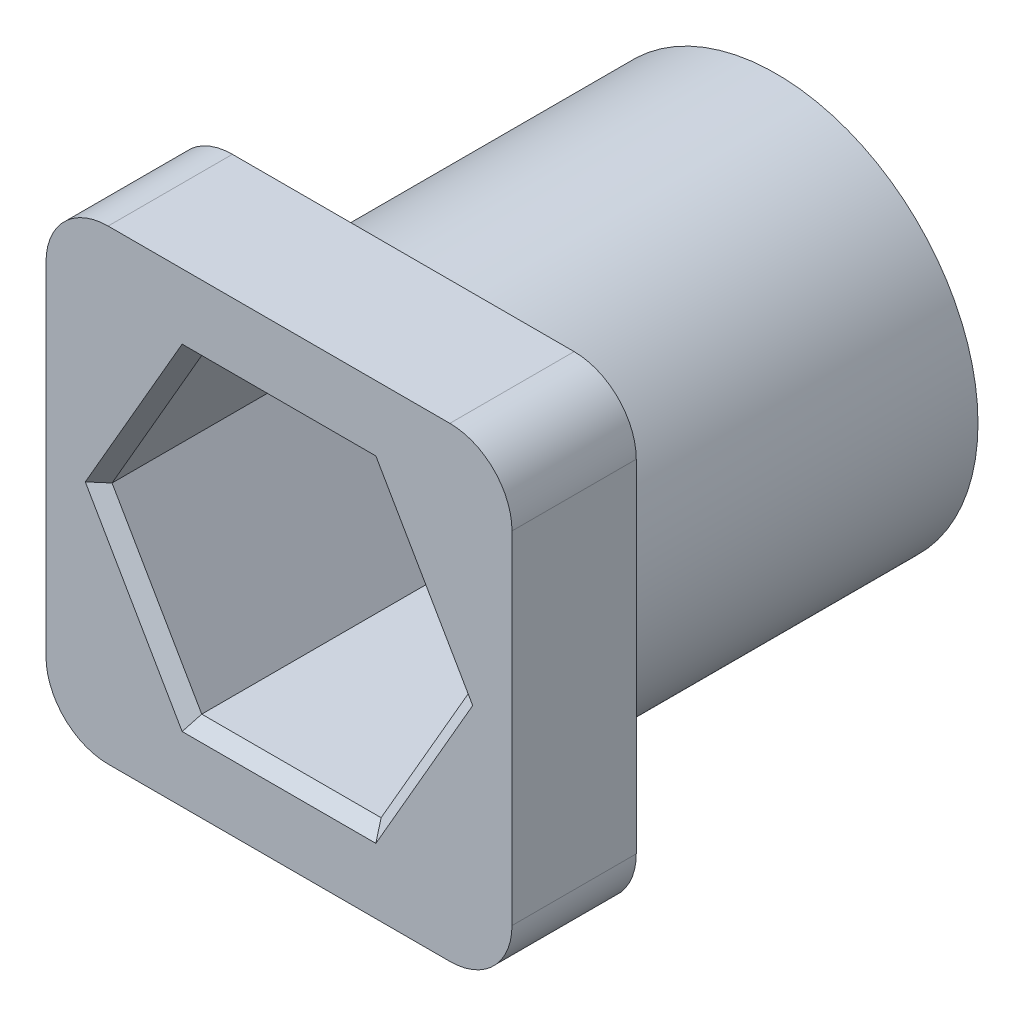
ISO-10303-21;
HEADER;
FILE_DESCRIPTION(('STEP AP214'),'2;1');
FILE_NAME('part.step','',(''),(''),'','','');
FILE_SCHEMA(('AUTOMOTIVE_DESIGN { 1 0 10303 214 1 1 1 1 }'));
ENDSEC;
DATA;
#1=APPLICATION_CONTEXT('core data for automotive mechanical design processes');
#2=APPLICATION_PROTOCOL_DEFINITION('international standard','automotive_design',2000,#1);
#3=PRODUCT_CONTEXT('',#1,'mechanical');
#4=PRODUCT('Part','Part','',(#3));
#5=PRODUCT_RELATED_PRODUCT_CATEGORY('part','',(#4));
#6=PRODUCT_DEFINITION_FORMATION('','',#4);
#7=PRODUCT_DEFINITION_CONTEXT('part definition',#1,'design');
#8=PRODUCT_DEFINITION('design','',#6,#7);
#9=PRODUCT_DEFINITION_SHAPE('','',#8);
#10=(LENGTH_UNIT() NAMED_UNIT(*) SI_UNIT(.MILLI.,.METRE.));
#11=(NAMED_UNIT(*) PLANE_ANGLE_UNIT() SI_UNIT($,.RADIAN.));
#12=(NAMED_UNIT(*) SI_UNIT($,.STERADIAN.) SOLID_ANGLE_UNIT());
#13=UNCERTAINTY_MEASURE_WITH_UNIT(LENGTH_MEASURE(1.E-05),#10,'distance_accuracy_value','');
#14=(GEOMETRIC_REPRESENTATION_CONTEXT(3) GLOBAL_UNCERTAINTY_ASSIGNED_CONTEXT((#13)) GLOBAL_UNIT_ASSIGNED_CONTEXT((#10,
#11,#12)) REPRESENTATION_CONTEXT('',''));
#15=CARTESIAN_POINT('',(0.,0.,0.));
#16=DIRECTION('',(0.,0.,1.));
#17=DIRECTION('',(1.,0.,0.));
#18=AXIS2_PLACEMENT_3D('',#15,#16,#17);
#19=CARTESIAN_POINT('',(9.525,-9.525,-5.08));
#20=DIRECTION('',(1.,0.,0.));
#21=DIRECTION('',(0.,0.,-1.));
#22=AXIS2_PLACEMENT_3D('',#19,#20,#21);
#23=PLANE('',#22);
#24=DIRECTION('',(0.,1.,0.));
#25=VECTOR('',#24,1.);
#26=CARTESIAN_POINT('',(9.525,-9.525,0.));
#27=LINE('',#26,#25);
#28=CARTESIAN_POINT('',(9.525,-6.985,0.));
#29=VERTEX_POINT('',#28);
#30=CARTESIAN_POINT('',(9.525,6.98499999999999,0.));
#31=VERTEX_POINT('',#30);
#32=EDGE_CURVE('E202',#29,#31,#27,.T.);
#33=ORIENTED_EDGE('',*,*,#32,.F.);
#34=DIRECTION('',(0.,0.,1.));
#35=VECTOR('',#34,1.);
#36=CARTESIAN_POINT('',(9.525,-6.985,-5.08));
#37=LINE('',#36,#35);
#38=CARTESIAN_POINT('',(9.525,-6.985,-5.08));
#39=VERTEX_POINT('',#38);
#40=EDGE_CURVE('E244',#29,#39,#37,.F.);
#41=ORIENTED_EDGE('',*,*,#40,.T.);
#42=DIRECTION('',(0.,1.,0.));
#43=VECTOR('',#42,1.);
#44=CARTESIAN_POINT('',(9.525,-9.525,-5.08));
#45=LINE('',#44,#43);
#46=CARTESIAN_POINT('',(9.525,6.98499999999999,-5.08));
#47=VERTEX_POINT('',#46);
#48=EDGE_CURVE('E205',#39,#47,#45,.T.);
#49=ORIENTED_EDGE('',*,*,#48,.T.);
#50=DIRECTION('',(0.,0.,1.));
#51=VECTOR('',#50,1.);
#52=CARTESIAN_POINT('',(9.525,6.985,-5.08));
#53=LINE('',#52,#51);
#54=EDGE_CURVE('E241',#47,#31,#53,.T.);
#55=ORIENTED_EDGE('',*,*,#54,.T.);
#56=EDGE_LOOP('',(#33,#41,#49,#55));
#57=FACE_BOUND('',#56,.T.);
#58=ADVANCED_FACE('F33',(#57),#23,.T.);
#59=CARTESIAN_POINT('',(-9.525,-9.525,-5.08));
#60=DIRECTION('',(0.,-1.,0.));
#61=DIRECTION('',(0.,0.,-1.));
#62=AXIS2_PLACEMENT_3D('',#59,#60,#61);
#63=PLANE('',#62);
#64=DIRECTION('',(1.,0.,0.));
#65=VECTOR('',#64,1.);
#66=CARTESIAN_POINT('',(-9.525,-9.525,-5.08));
#67=LINE('',#66,#65);
#68=CARTESIAN_POINT('',(-6.985,-9.525,-5.08));
#69=VERTEX_POINT('',#68);
#70=CARTESIAN_POINT('',(6.98499999999999,-9.525,-5.08));
#71=VERTEX_POINT('',#70);
#72=EDGE_CURVE('E215',#69,#71,#67,.T.);
#73=ORIENTED_EDGE('',*,*,#72,.T.);
#74=DIRECTION('',(0.,0.,1.));
#75=VECTOR('',#74,1.);
#76=CARTESIAN_POINT('',(6.985,-9.525,-5.08));
#77=LINE('',#76,#75);
#78=CARTESIAN_POINT('',(6.98499999999999,-9.525,0.));
#79=VERTEX_POINT('',#78);
#80=EDGE_CURVE('E230',#71,#79,#77,.T.);
#81=ORIENTED_EDGE('',*,*,#80,.T.);
#82=DIRECTION('',(1.,0.,0.));
#83=VECTOR('',#82,1.);
#84=CARTESIAN_POINT('',(-9.525,-9.525,0.));
#85=LINE('',#84,#83);
#86=CARTESIAN_POINT('',(-6.985,-9.525,0.));
#87=VERTEX_POINT('',#86);
#88=EDGE_CURVE('E209',#87,#79,#85,.T.);
#89=ORIENTED_EDGE('',*,*,#88,.F.);
#90=DIRECTION('',(0.,0.,1.));
#91=VECTOR('',#90,1.);
#92=CARTESIAN_POINT('',(-6.985,-9.525,-5.08));
#93=LINE('',#92,#91);
#94=EDGE_CURVE('E218',#87,#69,#93,.F.);
#95=ORIENTED_EDGE('',*,*,#94,.T.);
#96=EDGE_LOOP('',(#73,#81,#89,#95));
#97=FACE_BOUND('',#96,.T.);
#98=ADVANCED_FACE('F322',(#97),#63,.T.);
#99=CARTESIAN_POINT('',(-9.525,-9.525,-5.08));
#100=DIRECTION('',(-1.,0.,0.));
#101=DIRECTION('',(0.,0.,1.));
#102=AXIS2_PLACEMENT_3D('',#99,#100,#101);
#103=PLANE('',#102);
#104=DIRECTION('',(0.,-1.,0.));
#105=VECTOR('',#104,1.);
#106=CARTESIAN_POINT('',(-9.525,-9.525,-5.08));
#107=LINE('',#106,#105);
#108=CARTESIAN_POINT('',(-9.525,6.98499999999999,-5.08));
#109=VERTEX_POINT('',#108);
#110=CARTESIAN_POINT('',(-9.525,-6.985,-5.08));
#111=VERTEX_POINT('',#110);
#112=EDGE_CURVE('E212',#109,#111,#107,.T.);
#113=ORIENTED_EDGE('',*,*,#112,.T.);
#114=DIRECTION('',(0.,0.,1.));
#115=VECTOR('',#114,1.);
#116=CARTESIAN_POINT('',(-9.525,-6.985,-5.08));
#117=LINE('',#116,#115);
#118=CARTESIAN_POINT('',(-9.525,-6.985,0.));
#119=VERTEX_POINT('',#118);
#120=EDGE_CURVE('E256',#111,#119,#117,.T.);
#121=ORIENTED_EDGE('',*,*,#120,.T.);
#122=DIRECTION('',(0.,-1.,0.));
#123=VECTOR('',#122,1.);
#124=CARTESIAN_POINT('',(-9.525,-9.525,0.));
#125=LINE('',#124,#123);
#126=CARTESIAN_POINT('',(-9.525,6.98499999999999,0.));
#127=VERTEX_POINT('',#126);
#128=EDGE_CURVE('E224',#127,#119,#125,.T.);
#129=ORIENTED_EDGE('',*,*,#128,.F.);
#130=DIRECTION('',(0.,0.,1.));
#131=VECTOR('',#130,1.);
#132=CARTESIAN_POINT('',(-9.525,6.985,-5.08));
#133=LINE('',#132,#131);
#134=EDGE_CURVE('E254',#127,#109,#133,.F.);
#135=ORIENTED_EDGE('',*,*,#134,.T.);
#136=EDGE_LOOP('',(#113,#121,#129,#135));
#137=FACE_BOUND('',#136,.T.);
#138=ADVANCED_FACE('F328',(#137),#103,.T.);
#139=CARTESIAN_POINT('',(-9.525,9.525,-5.08));
#140=DIRECTION('',(0.,1.,0.));
#141=DIRECTION('',(0.,0.,1.));
#142=AXIS2_PLACEMENT_3D('',#139,#140,#141);
#143=PLANE('',#142);
#144=DIRECTION('',(-1.,0.,0.));
#145=VECTOR('',#144,1.);
#146=CARTESIAN_POINT('',(-9.525,9.525,0.));
#147=LINE('',#146,#145);
#148=CARTESIAN_POINT('',(6.98499999999999,9.525,0.));
#149=VERTEX_POINT('',#148);
#150=CARTESIAN_POINT('',(-6.985,9.525,0.));
#151=VERTEX_POINT('',#150);
#152=EDGE_CURVE('E221',#149,#151,#147,.T.);
#153=ORIENTED_EDGE('',*,*,#152,.F.);
#154=DIRECTION('',(0.,0.,1.));
#155=VECTOR('',#154,1.);
#156=CARTESIAN_POINT('',(6.985,9.525,-5.08));
#157=LINE('',#156,#155);
#158=CARTESIAN_POINT('',(6.98499999999999,9.525,-5.08));
#159=VERTEX_POINT('',#158);
#160=EDGE_CURVE('E262',#149,#159,#157,.F.);
#161=ORIENTED_EDGE('',*,*,#160,.T.);
#162=DIRECTION('',(-1.,0.,0.));
#163=VECTOR('',#162,1.);
#164=CARTESIAN_POINT('',(-9.525,9.525,-5.08));
#165=LINE('',#164,#163);
#166=CARTESIAN_POINT('',(-6.985,9.525,-5.08));
#167=VERTEX_POINT('',#166);
#168=EDGE_CURVE('E208',#159,#167,#165,.T.);
#169=ORIENTED_EDGE('',*,*,#168,.T.);
#170=DIRECTION('',(0.,0.,1.));
#171=VECTOR('',#170,1.);
#172=CARTESIAN_POINT('',(-6.985,9.525,-5.08));
#173=LINE('',#172,#171);
#174=EDGE_CURVE('E259',#167,#151,#173,.T.);
#175=ORIENTED_EDGE('',*,*,#174,.T.);
#176=EDGE_LOOP('',(#153,#161,#169,#175));
#177=FACE_BOUND('',#176,.T.);
#178=ADVANCED_FACE('F334',(#177),#143,.T.);
#179=CARTESIAN_POINT('',(0.,0.,-5.08));
#180=DIRECTION('',(0.,0.,-1.));
#181=DIRECTION('',(-1.,0.,0.));
#182=AXIS2_PLACEMENT_3D('',#179,#180,#181);
#183=PLANE('',#182);
#184=CARTESIAN_POINT('',(0.,0.,-5.08));
#185=DIRECTION('',(0.,0.,-1.));
#186=DIRECTION('',(-1.,0.,0.));
#187=AXIS2_PLACEMENT_3D('',#184,#185,#186);
#188=CIRCLE('',#187,8.255);
#189=CARTESIAN_POINT('',(8.255,0.,-5.08));
#190=VERTEX_POINT('',#189);
#191=EDGE_CURVE('E189',#190,#190,#188,.T.);
#192=ORIENTED_EDGE('',*,*,#191,.F.);
#193=EDGE_LOOP('',(#192));
#194=FACE_BOUND('',#193,.T.);
#195=ORIENTED_EDGE('',*,*,#48,.F.);
#196=CARTESIAN_POINT('',(6.985,-6.985,-5.08));
#197=DIRECTION('',(0.,0.,-1.));
#198=DIRECTION('',(-1.,0.,0.));
#199=AXIS2_PLACEMENT_3D('',#196,#197,#198);
#200=CIRCLE('',#199,2.54);
#201=EDGE_CURVE('E252',#39,#71,#200,.T.);
#202=ORIENTED_EDGE('',*,*,#201,.T.);
#203=ORIENTED_EDGE('',*,*,#72,.F.);
#204=CARTESIAN_POINT('',(-6.985,-6.985,-5.08));
#205=DIRECTION('',(0.,0.,-1.));
#206=DIRECTION('',(-1.,0.,0.));
#207=AXIS2_PLACEMENT_3D('',#204,#205,#206);
#208=CIRCLE('',#207,2.54);
#209=EDGE_CURVE('E250',#69,#111,#208,.T.);
#210=ORIENTED_EDGE('',*,*,#209,.T.);
#211=ORIENTED_EDGE('',*,*,#112,.F.);
#212=CARTESIAN_POINT('',(-6.985,6.985,-5.08));
#213=DIRECTION('',(0.,0.,-1.));
#214=DIRECTION('',(-1.,0.,0.));
#215=AXIS2_PLACEMENT_3D('',#212,#213,#214);
#216=CIRCLE('',#215,2.54);
#217=EDGE_CURVE('E246',#109,#167,#216,.T.);
#218=ORIENTED_EDGE('',*,*,#217,.T.);
#219=ORIENTED_EDGE('',*,*,#168,.F.);
#220=CARTESIAN_POINT('',(6.985,6.985,-5.08));
#221=DIRECTION('',(0.,0.,-1.));
#222=DIRECTION('',(-1.,0.,0.));
#223=AXIS2_PLACEMENT_3D('',#220,#221,#222);
#224=CIRCLE('',#223,2.54);
#225=EDGE_CURVE('E248',#159,#47,#224,.T.);
#226=ORIENTED_EDGE('',*,*,#225,.T.);
#227=EDGE_LOOP('',(#195,#202,#203,#210,#211,#218,#219,#226));
#228=FACE_BOUND('',#227,.T.);
#229=ADVANCED_FACE('F395',(#194,#228),#183,.T.);
#230=CARTESIAN_POINT('',(0.,0.,0.));
#231=DIRECTION('',(0.,0.,-1.));
#232=DIRECTION('',(-1.,0.,0.));
#233=AXIS2_PLACEMENT_3D('',#230,#231,#232);
#234=PLANE('',#233);
#235=DIRECTION('',(1.,0.,0.));
#236=VECTOR('',#235,1.);
#237=CARTESIAN_POINT('',(0.,6.85800000000001,0.));
#238=LINE('',#237,#236);
#239=CARTESIAN_POINT('',(-3.95946814610246,6.85800000000001,0.));
#240=VERTEX_POINT('',#239);
#241=CARTESIAN_POINT('',(3.95946814610246,6.85800000000001,0.));
#242=VERTEX_POINT('',#241);
#243=EDGE_CURVE('E265',#240,#242,#238,.T.);
#244=ORIENTED_EDGE('',*,*,#243,.T.);
#245=DIRECTION('',(0.5,-0.866025403784439,0.));
#246=VECTOR('',#245,1.);
#247=CARTESIAN_POINT('',(5.93920221915369,3.42900000000001,0.));
#248=LINE('',#247,#246);
#249=CARTESIAN_POINT('',(7.91893629220492,0.,0.));
#250=VERTEX_POINT('',#249);
#251=EDGE_CURVE('E275',#242,#250,#248,.T.);
#252=ORIENTED_EDGE('',*,*,#251,.T.);
#253=DIRECTION('',(-0.5,-0.866025403784439,0.));
#254=VECTOR('',#253,1.);
#255=CARTESIAN_POINT('',(5.93920221915369,-3.42900000000001,0.));
#256=LINE('',#255,#254);
#257=CARTESIAN_POINT('',(3.95946814610246,-6.85800000000001,0.));
#258=VERTEX_POINT('',#257);
#259=EDGE_CURVE('E273',#250,#258,#256,.T.);
#260=ORIENTED_EDGE('',*,*,#259,.T.);
#261=DIRECTION('',(-1.,0.,0.));
#262=VECTOR('',#261,1.);
#263=CARTESIAN_POINT('',(0.,-6.85800000000001,0.));
#264=LINE('',#263,#262);
#265=CARTESIAN_POINT('',(-3.95946814610246,-6.85800000000001,0.));
#266=VERTEX_POINT('',#265);
#267=EDGE_CURVE('E271',#258,#266,#264,.T.);
#268=ORIENTED_EDGE('',*,*,#267,.T.);
#269=DIRECTION('',(-0.5,0.866025403784439,0.));
#270=VECTOR('',#269,1.);
#271=CARTESIAN_POINT('',(-5.93920221915369,-3.429,0.));
#272=LINE('',#271,#270);
#273=CARTESIAN_POINT('',(-7.91893629220492,0.,0.));
#274=VERTEX_POINT('',#273);
#275=EDGE_CURVE('E269',#266,#274,#272,.T.);
#276=ORIENTED_EDGE('',*,*,#275,.T.);
#277=DIRECTION('',(0.5,0.866025403784439,0.));
#278=VECTOR('',#277,1.);
#279=CARTESIAN_POINT('',(-5.93920221915369,3.429,0.));
#280=LINE('',#279,#278);
#281=EDGE_CURVE('E267',#274,#240,#280,.T.);
#282=ORIENTED_EDGE('',*,*,#281,.T.);
#283=EDGE_LOOP('',(#244,#252,#260,#268,#276,#282));
#284=FACE_BOUND('',#283,.T.);
#285=ORIENTED_EDGE('',*,*,#88,.T.);
#286=CARTESIAN_POINT('',(6.985,-6.985,0.));
#287=DIRECTION('',(0.,0.,-1.));
#288=DIRECTION('',(-1.,0.,0.));
#289=AXIS2_PLACEMENT_3D('',#286,#287,#288);
#290=CIRCLE('',#289,2.54);
#291=EDGE_CURVE('E239',#79,#29,#290,.F.);
#292=ORIENTED_EDGE('',*,*,#291,.T.);
#293=ORIENTED_EDGE('',*,*,#32,.T.);
#294=CARTESIAN_POINT('',(6.985,6.985,0.));
#295=DIRECTION('',(0.,0.,-1.));
#296=DIRECTION('',(-1.,0.,0.));
#297=AXIS2_PLACEMENT_3D('',#294,#295,#296);
#298=CIRCLE('',#297,2.54);
#299=EDGE_CURVE('E235',#31,#149,#298,.F.);
#300=ORIENTED_EDGE('',*,*,#299,.T.);
#301=ORIENTED_EDGE('',*,*,#152,.T.);
#302=CARTESIAN_POINT('',(-6.985,6.985,0.));
#303=DIRECTION('',(0.,0.,-1.));
#304=DIRECTION('',(-1.,0.,0.));
#305=AXIS2_PLACEMENT_3D('',#302,#303,#304);
#306=CIRCLE('',#305,2.54);
#307=EDGE_CURVE('E233',#151,#127,#306,.F.);
#308=ORIENTED_EDGE('',*,*,#307,.T.);
#309=ORIENTED_EDGE('',*,*,#128,.T.);
#310=CARTESIAN_POINT('',(-6.985,-6.985,0.));
#311=DIRECTION('',(0.,0.,-1.));
#312=DIRECTION('',(-1.,0.,0.));
#313=AXIS2_PLACEMENT_3D('',#310,#311,#312);
#314=CIRCLE('',#313,2.54);
#315=EDGE_CURVE('E237',#119,#87,#314,.F.);
#316=ORIENTED_EDGE('',*,*,#315,.T.);
#317=EDGE_LOOP('',(#285,#292,#293,#300,#301,#308,#309,#316));
#318=FACE_BOUND('',#317,.T.);
#319=ADVANCED_FACE('F393',(#284,#318),#234,.F.);
#320=CARTESIAN_POINT('',(0.,0.,-20.32));
#321=DIRECTION('',(0.,0.,1.));
#322=DIRECTION('',(1.,0.,0.));
#323=AXIS2_PLACEMENT_3D('',#320,#321,#322);
#324=CYLINDRICAL_SURFACE('',#323,8.255);
#325=CARTESIAN_POINT('',(0.,0.,-20.32));
#326=DIRECTION('',(0.,0.,-1.));
#327=DIRECTION('',(-1.,0.,0.));
#328=AXIS2_PLACEMENT_3D('',#325,#326,#327);
#329=CIRCLE('',#328,8.255);
#330=CARTESIAN_POINT('',(8.255,0.,-20.32));
#331=VERTEX_POINT('',#330);
#332=EDGE_CURVE('E199',#331,#331,#329,.T.);
#333=CARTESIAN_POINT('',(8.255,0.,-20.32));
#334=CARTESIAN_POINT('',(8.255,0.,-20.16125));
#335=CARTESIAN_POINT('',(8.255,0.,-20.0025));
#336=CARTESIAN_POINT('',(8.255,0.,-19.685));
#337=CARTESIAN_POINT('',(8.255,0.,-19.52625));
#338=CARTESIAN_POINT('',(8.255,0.,-19.20875));
#339=CARTESIAN_POINT('',(8.255,0.,-19.05));
#340=CARTESIAN_POINT('',(8.255,0.,-18.7325));
#341=CARTESIAN_POINT('',(8.255,0.,-18.57375));
#342=CARTESIAN_POINT('',(8.255,0.,-18.25625));
#343=CARTESIAN_POINT('',(8.255,0.,-18.0975));
#344=CARTESIAN_POINT('',(8.255,0.,-17.78));
#345=CARTESIAN_POINT('',(8.255,0.,-17.62125));
#346=CARTESIAN_POINT('',(8.255,0.,-17.30375));
#347=CARTESIAN_POINT('',(8.255,0.,-17.145));
#348=CARTESIAN_POINT('',(8.255,0.,-16.8275));
#349=CARTESIAN_POINT('',(8.255,0.,-16.66875));
#350=CARTESIAN_POINT('',(8.255,0.,-16.35125));
#351=CARTESIAN_POINT('',(8.255,0.,-16.1925));
#352=CARTESIAN_POINT('',(8.255,0.,-15.875));
#353=CARTESIAN_POINT('',(8.255,0.,-15.71625));
#354=CARTESIAN_POINT('',(8.255,0.,-15.39875));
#355=CARTESIAN_POINT('',(8.255,0.,-15.24));
#356=CARTESIAN_POINT('',(8.255,0.,-14.9225));
#357=CARTESIAN_POINT('',(8.255,0.,-14.76375));
#358=CARTESIAN_POINT('',(8.255,0.,-14.44625));
#359=CARTESIAN_POINT('',(8.255,0.,-14.2875));
#360=CARTESIAN_POINT('',(8.255,0.,-13.97));
#361=CARTESIAN_POINT('',(8.255,0.,-13.81125));
#362=CARTESIAN_POINT('',(8.255,0.,-13.49375));
#363=CARTESIAN_POINT('',(8.255,0.,-13.335));
#364=CARTESIAN_POINT('',(8.255,0.,-13.0175));
#365=CARTESIAN_POINT('',(8.255,0.,-12.85875));
#366=CARTESIAN_POINT('',(8.255,0.,-12.54125));
#367=CARTESIAN_POINT('',(8.255,0.,-12.3825));
#368=CARTESIAN_POINT('',(8.255,0.,-12.065));
#369=CARTESIAN_POINT('',(8.255,0.,-11.90625));
#370=CARTESIAN_POINT('',(8.255,0.,-11.58875));
#371=CARTESIAN_POINT('',(8.255,0.,-11.43));
#372=CARTESIAN_POINT('',(8.255,0.,-11.1125));
#373=CARTESIAN_POINT('',(8.255,0.,-10.95375));
#374=CARTESIAN_POINT('',(8.255,0.,-10.63625));
#375=CARTESIAN_POINT('',(8.255,0.,-10.4775));
#376=CARTESIAN_POINT('',(8.255,0.,-10.16));
#377=CARTESIAN_POINT('',(8.255,0.,-10.00125));
#378=CARTESIAN_POINT('',(8.255,0.,-9.68375));
#379=CARTESIAN_POINT('',(8.255,0.,-9.525));
#380=CARTESIAN_POINT('',(8.255,0.,-9.2075));
#381=CARTESIAN_POINT('',(8.255,0.,-9.04875));
#382=CARTESIAN_POINT('',(8.255,0.,-8.73125));
#383=CARTESIAN_POINT('',(8.255,0.,-8.5725));
#384=CARTESIAN_POINT('',(8.255,0.,-8.255));
#385=CARTESIAN_POINT('',(8.255,0.,-8.09625));
#386=CARTESIAN_POINT('',(8.255,0.,-7.77875));
#387=CARTESIAN_POINT('',(8.255,0.,-7.62));
#388=CARTESIAN_POINT('',(8.255,0.,-7.3025));
#389=CARTESIAN_POINT('',(8.255,0.,-7.14375));
#390=CARTESIAN_POINT('',(8.255,0.,-6.82625));
#391=CARTESIAN_POINT('',(8.255,0.,-6.6675));
#392=CARTESIAN_POINT('',(8.255,0.,-6.35));
#393=CARTESIAN_POINT('',(8.255,0.,-6.19125));
#394=CARTESIAN_POINT('',(8.255,0.,-5.87375));
#395=CARTESIAN_POINT('',(8.255,0.,-5.715));
#396=CARTESIAN_POINT('',(8.255,0.,-5.3975));
#397=CARTESIAN_POINT('',(8.255,0.,-5.23875));
#398=CARTESIAN_POINT('',(8.255,0.,-5.08));
#399=B_SPLINE_CURVE_WITH_KNOTS('',3,(#333,#334,#335,#336,#337,#338,#339,#340,#341,#342,#343,
#344,#345,#346,#347,#348,#349,#350,#351,#352,#353,#354,#355,#356,#357,#358,#359,#360,#361,#362,
#363,#364,#365,#366,#367,#368,#369,#370,#371,#372,#373,#374,#375,#376,#377,#378,#379,#380,#381,
#382,#383,#384,#385,#386,#387,#388,#389,#390,#391,#392,#393,#394,#395,#396,#397,#398),
.UNSPECIFIED.,.F.,.F.,(4,2,2,2,2,2,2,2,2,2,2,2,2,2,2,2,2,2,2,2,2,2,2,2,2,2,2,2,2,2,2,2,4),(0.,
0.476250000000001,0.952500000000002,1.42875,1.905,2.38125,2.8575,3.33375,3.81,4.28625,4.7625,
5.23875,5.715,6.19125,6.6675,7.14375,7.62,8.09625,8.5725,9.04875,9.525,10.00125,10.4775,
10.95375,11.43,11.90625,12.3825,12.85875,13.335,13.81125,14.2875,14.76375,15.24),.UNSPECIFIED.);
#400=EDGE_CURVE('BSEAM388',#331,#190,#399,.T.);
#401=ORIENTED_EDGE('',*,*,#332,.F.);
#402=ORIENTED_EDGE('',*,*,#191,.T.);
#403=ORIENTED_EDGE('',*,*,#400,.T.);
#404=ORIENTED_EDGE('',*,*,#400,.F.);
#405=EDGE_LOOP('',(#401,#403,#402,#404));
#406=FACE_BOUND('',#405,.T.);
#407=ADVANCED_FACE('F388',(#406),#324,.T.);
#408=CARTESIAN_POINT('',(0.,0.,-20.32));
#409=DIRECTION('',(0.,0.,-1.));
#410=DIRECTION('',(-1.,0.,0.));
#411=AXIS2_PLACEMENT_3D('',#408,#409,#410);
#412=PLANE('',#411);
#413=DIRECTION('',(-0.5,0.866025403784439,0.));
#414=VECTOR('',#413,1.);
#415=CARTESIAN_POINT('',(7.33234841870825,0.,-20.32));
#416=LINE('',#415,#414);
#417=CARTESIAN_POINT('',(7.33234841870825,0.,-20.32));
#418=VERTEX_POINT('',#417);
#419=CARTESIAN_POINT('',(3.66617420935412,6.35,-20.32));
#420=VERTEX_POINT('',#419);
#421=EDGE_CURVE('E158',#418,#420,#416,.T.);
#422=ORIENTED_EDGE('',*,*,#421,.T.);
#423=DIRECTION('',(-1.,0.,0.));
#424=VECTOR('',#423,1.);
#425=CARTESIAN_POINT('',(3.66617420935412,6.35,-20.32));
#426=LINE('',#425,#424);
#427=CARTESIAN_POINT('',(-3.66617420935412,6.35,-20.32));
#428=VERTEX_POINT('',#427);
#429=EDGE_CURVE('E166',#420,#428,#426,.T.);
#430=ORIENTED_EDGE('',*,*,#429,.T.);
#431=DIRECTION('',(-0.5,-0.866025403784439,0.));
#432=VECTOR('',#431,1.);
#433=CARTESIAN_POINT('',(-3.66617420935412,6.35,-20.32));
#434=LINE('',#433,#432);
#435=CARTESIAN_POINT('',(-7.33234841870825,0.,-20.32));
#436=VERTEX_POINT('',#435);
#437=EDGE_CURVE('E170',#428,#436,#434,.T.);
#438=ORIENTED_EDGE('',*,*,#437,.T.);
#439=DIRECTION('',(0.5,-0.866025403784439,0.));
#440=VECTOR('',#439,1.);
#441=CARTESIAN_POINT('',(-7.33234841870825,0.,-20.32));
#442=LINE('',#441,#440);
#443=CARTESIAN_POINT('',(-3.66617420935412,-6.35,-20.32));
#444=VERTEX_POINT('',#443);
#445=EDGE_CURVE('E181',#436,#444,#442,.T.);
#446=ORIENTED_EDGE('',*,*,#445,.T.);
#447=DIRECTION('',(1.,0.,0.));
#448=VECTOR('',#447,1.);
#449=CARTESIAN_POINT('',(-3.66617420935412,-6.35,-20.32));
#450=LINE('',#449,#448);
#451=CARTESIAN_POINT('',(3.66617420935412,-6.35,-20.32));
#452=VERTEX_POINT('',#451);
#453=EDGE_CURVE('E184',#444,#452,#450,.T.);
#454=ORIENTED_EDGE('',*,*,#453,.T.);
#455=DIRECTION('',(0.5,0.866025403784438,0.));
#456=VECTOR('',#455,1.);
#457=CARTESIAN_POINT('',(3.66617420935412,-6.35,-20.32));
#458=LINE('',#457,#456);
#459=EDGE_CURVE('E163',#452,#418,#458,.T.);
#460=ORIENTED_EDGE('',*,*,#459,.T.);
#461=EDGE_LOOP('',(#422,#430,#438,#446,#454,#460));
#462=FACE_BOUND('',#461,.T.);
#463=ORIENTED_EDGE('',*,*,#332,.T.);
#464=EDGE_LOOP('',(#463));
#465=FACE_BOUND('',#464,.T.);
#466=ADVANCED_FACE('F172',(#462,#465),#412,.T.);
#467=CARTESIAN_POINT('',(7.33234841870825,0.,-20.32));
#468=DIRECTION('',(0.866025403784439,0.5,0.));
#469=DIRECTION('',(-0.5,0.866025403784439,0.));
#470=AXIS2_PLACEMENT_3D('',#467,#468,#469);
#471=PLANE('',#470);
#472=DIRECTION('',(0.,0.,1.));
#473=VECTOR('',#472,1.);
#474=CARTESIAN_POINT('',(7.33234841870825,0.,-20.32));
#475=LINE('',#474,#473);
#476=CARTESIAN_POINT('',(7.33234841870825,0.,-0.508000000000002));
#477=VERTEX_POINT('',#476);
#478=EDGE_CURVE('E187',#418,#477,#475,.T.);
#479=ORIENTED_EDGE('',*,*,#478,.T.);
#480=DIRECTION('',(-0.5,0.866025403784439,0.));
#481=VECTOR('',#480,1.);
#482=CARTESIAN_POINT('',(7.33234841870825,0.,-0.508000000000002));
#483=LINE('',#482,#481);
#484=CARTESIAN_POINT('',(3.66617420935412,6.35,-0.508000000000002));
#485=VERTEX_POINT('',#484);
#486=EDGE_CURVE('E161',#477,#485,#483,.T.);
#487=ORIENTED_EDGE('',*,*,#486,.T.);
#488=DIRECTION('',(0.,0.,1.));
#489=VECTOR('',#488,1.);
#490=CARTESIAN_POINT('',(3.66617420935412,6.35,-20.32));
#491=LINE('',#490,#489);
#492=EDGE_CURVE('E153',#420,#485,#491,.T.);
#493=ORIENTED_EDGE('',*,*,#492,.F.);
#494=ORIENTED_EDGE('',*,*,#421,.F.);
#495=EDGE_LOOP('',(#479,#487,#493,#494));
#496=FACE_BOUND('',#495,.T.);
#497=ADVANCED_FACE('F156',(#496),#471,.F.);
#498=CARTESIAN_POINT('',(3.66617420935412,-6.35,-20.32));
#499=DIRECTION('',(0.866025403784439,-0.5,0.));
#500=DIRECTION('',(0.5,0.866025403784439,0.));
#501=AXIS2_PLACEMENT_3D('',#498,#499,#500);
#502=PLANE('',#501);
#503=DIRECTION('',(0.,0.,1.));
#504=VECTOR('',#503,1.);
#505=CARTESIAN_POINT('',(3.66617420935412,-6.35,-20.32));
#506=LINE('',#505,#504);
#507=CARTESIAN_POINT('',(3.66617420935412,-6.35,-0.508000000000002));
#508=VERTEX_POINT('',#507);
#509=EDGE_CURVE('E190',#452,#508,#506,.T.);
#510=ORIENTED_EDGE('',*,*,#509,.T.);
#511=DIRECTION('',(0.5,0.866025403784439,0.));
#512=VECTOR('',#511,1.);
#513=CARTESIAN_POINT('',(3.66617420935412,-6.35,-0.508000000000002));
#514=LINE('',#513,#512);
#515=EDGE_CURVE('E278',#508,#477,#514,.T.);
#516=ORIENTED_EDGE('',*,*,#515,.T.);
#517=ORIENTED_EDGE('',*,*,#478,.F.);
#518=ORIENTED_EDGE('',*,*,#459,.F.);
#519=EDGE_LOOP('',(#510,#516,#517,#518));
#520=FACE_BOUND('',#519,.T.);
#521=ADVANCED_FACE('F376',(#520),#502,.F.);
#522=CARTESIAN_POINT('',(-3.66617420935412,-6.35,-20.32));
#523=DIRECTION('',(0.,-1.,0.));
#524=DIRECTION('',(0.,0.,-1.));
#525=AXIS2_PLACEMENT_3D('',#522,#523,#524);
#526=PLANE('',#525);
#527=DIRECTION('',(0.,0.,1.));
#528=VECTOR('',#527,1.);
#529=CARTESIAN_POINT('',(-3.66617420935412,-6.35,-20.32));
#530=LINE('',#529,#528);
#531=CARTESIAN_POINT('',(-3.66617420935412,-6.35,-0.508000000000002));
#532=VERTEX_POINT('',#531);
#533=EDGE_CURVE('E193',#444,#532,#530,.T.);
#534=ORIENTED_EDGE('',*,*,#533,.T.);
#535=DIRECTION('',(1.,0.,0.));
#536=VECTOR('',#535,1.);
#537=CARTESIAN_POINT('',(-3.66617420935412,-6.35,-0.508000000000002));
#538=LINE('',#537,#536);
#539=EDGE_CURVE('E280',#532,#508,#538,.T.);
#540=ORIENTED_EDGE('',*,*,#539,.T.);
#541=ORIENTED_EDGE('',*,*,#509,.F.);
#542=ORIENTED_EDGE('',*,*,#453,.F.);
#543=EDGE_LOOP('',(#534,#540,#541,#542));
#544=FACE_BOUND('',#543,.T.);
#545=ADVANCED_FACE('F310',(#544),#526,.F.);
#546=CARTESIAN_POINT('',(-7.33234841870825,0.,-20.32));
#547=DIRECTION('',(-0.866025403784439,-0.5,0.));
#548=DIRECTION('',(0.5,-0.866025403784439,0.));
#549=AXIS2_PLACEMENT_3D('',#546,#547,#548);
#550=PLANE('',#549);
#551=DIRECTION('',(0.,0.,1.));
#552=VECTOR('',#551,1.);
#553=CARTESIAN_POINT('',(-7.33234841870825,0.,-20.32));
#554=LINE('',#553,#552);
#555=CARTESIAN_POINT('',(-7.33234841870825,0.,-0.508000000000002));
#556=VERTEX_POINT('',#555);
#557=EDGE_CURVE('E196',#436,#556,#554,.T.);
#558=ORIENTED_EDGE('',*,*,#557,.T.);
#559=DIRECTION('',(0.5,-0.866025403784439,0.));
#560=VECTOR('',#559,1.);
#561=CARTESIAN_POINT('',(-7.33234841870825,0.,-0.508000000000002));
#562=LINE('',#561,#560);
#563=EDGE_CURVE('E282',#556,#532,#562,.T.);
#564=ORIENTED_EDGE('',*,*,#563,.T.);
#565=ORIENTED_EDGE('',*,*,#533,.F.);
#566=ORIENTED_EDGE('',*,*,#445,.F.);
#567=EDGE_LOOP('',(#558,#564,#565,#566));
#568=FACE_BOUND('',#567,.T.);
#569=ADVANCED_FACE('F306',(#568),#550,.F.);
#570=CARTESIAN_POINT('',(-3.66617420935412,6.35,-20.32));
#571=DIRECTION('',(-0.866025403784439,0.5,0.));
#572=DIRECTION('',(-0.5,-0.866025403784439,0.));
#573=AXIS2_PLACEMENT_3D('',#570,#571,#572);
#574=PLANE('',#573);
#575=DIRECTION('',(0.,0.,1.));
#576=VECTOR('',#575,1.);
#577=CARTESIAN_POINT('',(-3.66617420935412,6.35,-20.32));
#578=LINE('',#577,#576);
#579=CARTESIAN_POINT('',(-3.66617420935412,6.35,-0.508000000000002));
#580=VERTEX_POINT('',#579);
#581=EDGE_CURVE('E162',#428,#580,#578,.T.);
#582=ORIENTED_EDGE('',*,*,#581,.T.);
#583=DIRECTION('',(-0.5,-0.866025403784439,0.));
#584=VECTOR('',#583,1.);
#585=CARTESIAN_POINT('',(-3.66617420935412,6.35,-0.508000000000002));
#586=LINE('',#585,#584);
#587=EDGE_CURVE('E42',#580,#556,#586,.T.);
#588=ORIENTED_EDGE('',*,*,#587,.T.);
#589=ORIENTED_EDGE('',*,*,#557,.F.);
#590=ORIENTED_EDGE('',*,*,#437,.F.);
#591=EDGE_LOOP('',(#582,#588,#589,#590));
#592=FACE_BOUND('',#591,.T.);
#593=ADVANCED_FACE('F311',(#592),#574,.F.);
#594=CARTESIAN_POINT('',(3.66617420935412,6.35,-20.32));
#595=DIRECTION('',(0.,1.,0.));
#596=DIRECTION('',(-1.,0.,0.));
#597=AXIS2_PLACEMENT_3D('',#594,#595,#596);
#598=PLANE('',#597);
#599=ORIENTED_EDGE('',*,*,#492,.T.);
#600=DIRECTION('',(-1.,0.,0.));
#601=VECTOR('',#600,1.);
#602=CARTESIAN_POINT('',(3.66617420935412,6.35,-0.508000000000002));
#603=LINE('',#602,#601);
#604=EDGE_CURVE('E11',#485,#580,#603,.T.);
#605=ORIENTED_EDGE('',*,*,#604,.T.);
#606=ORIENTED_EDGE('',*,*,#581,.F.);
#607=ORIENTED_EDGE('',*,*,#429,.F.);
#608=EDGE_LOOP('',(#599,#605,#606,#607));
#609=FACE_BOUND('',#608,.T.);
#610=ADVANCED_FACE('F167',(#609),#598,.F.);
#611=CARTESIAN_POINT('',(6.985,-6.985,-5.08));
#612=DIRECTION('',(0.,0.,1.));
#613=DIRECTION('',(1.,0.,0.));
#614=AXIS2_PLACEMENT_3D('',#611,#612,#613);
#615=CYLINDRICAL_SURFACE('',#614,2.54);
#616=ORIENTED_EDGE('',*,*,#201,.F.);
#617=ORIENTED_EDGE('',*,*,#40,.F.);
#618=ORIENTED_EDGE('',*,*,#291,.F.);
#619=ORIENTED_EDGE('',*,*,#80,.F.);
#620=EDGE_LOOP('',(#616,#617,#618,#619));
#621=FACE_BOUND('',#620,.T.);
#622=ADVANCED_FACE('F318',(#621),#615,.T.);
#623=CARTESIAN_POINT('',(-6.985,-6.985,-5.08));
#624=DIRECTION('',(0.,0.,1.));
#625=DIRECTION('',(1.,0.,0.));
#626=AXIS2_PLACEMENT_3D('',#623,#624,#625);
#627=CYLINDRICAL_SURFACE('',#626,2.54);
#628=ORIENTED_EDGE('',*,*,#209,.F.);
#629=ORIENTED_EDGE('',*,*,#94,.F.);
#630=ORIENTED_EDGE('',*,*,#315,.F.);
#631=ORIENTED_EDGE('',*,*,#120,.F.);
#632=EDGE_LOOP('',(#628,#629,#630,#631));
#633=FACE_BOUND('',#632,.T.);
#634=ADVANCED_FACE('F338',(#633),#627,.T.);
#635=CARTESIAN_POINT('',(6.985,6.985,-5.08));
#636=DIRECTION('',(0.,0.,1.));
#637=DIRECTION('',(1.,0.,0.));
#638=AXIS2_PLACEMENT_3D('',#635,#636,#637);
#639=CYLINDRICAL_SURFACE('',#638,2.54);
#640=ORIENTED_EDGE('',*,*,#225,.F.);
#641=ORIENTED_EDGE('',*,*,#160,.F.);
#642=ORIENTED_EDGE('',*,*,#299,.F.);
#643=ORIENTED_EDGE('',*,*,#54,.F.);
#644=EDGE_LOOP('',(#640,#641,#642,#643));
#645=FACE_BOUND('',#644,.T.);
#646=ADVANCED_FACE('F342',(#645),#639,.T.);
#647=CARTESIAN_POINT('',(-6.985,6.985,-5.08));
#648=DIRECTION('',(0.,0.,1.));
#649=DIRECTION('',(1.,0.,0.));
#650=AXIS2_PLACEMENT_3D('',#647,#648,#649);
#651=CYLINDRICAL_SURFACE('',#650,2.54);
#652=ORIENTED_EDGE('',*,*,#217,.F.);
#653=ORIENTED_EDGE('',*,*,#134,.F.);
#654=ORIENTED_EDGE('',*,*,#307,.F.);
#655=ORIENTED_EDGE('',*,*,#174,.F.);
#656=EDGE_LOOP('',(#652,#653,#654,#655));
#657=FACE_BOUND('',#656,.T.);
#658=ADVANCED_FACE('F346',(#657),#651,.T.);
#659=CARTESIAN_POINT('',(-7.33234841870825,0.,-0.508000000000002));
#660=DIRECTION('',(-0.612372435695791,-0.353553390593272,-0.707106781186552));
#661=DIRECTION('',(0.5,-0.866025403784439,0.));
#662=AXIS2_PLACEMENT_3D('',#659,#660,#661);
#663=PLANE('',#662);
#664=DIRECTION('',(0.755928946018459,0.,-0.654653670707972));
#665=VECTOR('',#664,1.);
#666=CARTESIAN_POINT('',(-7.33234841870825,0.,-0.508000000000002));
#667=LINE('',#666,#665);
#668=EDGE_CURVE('E178',#274,#556,#667,.T.);
#669=ORIENTED_EDGE('',*,*,#668,.F.);
#670=ORIENTED_EDGE('',*,*,#275,.F.);
#671=DIRECTION('',(0.377964473009228,0.654653670707981,-0.654653670707972));
#672=VECTOR('',#671,1.);
#673=CARTESIAN_POINT('',(-3.66617420935412,-6.35,-0.508000000000002));
#674=LINE('',#673,#672);
#675=EDGE_CURVE('E37',#532,#266,#674,.F.);
#676=ORIENTED_EDGE('',*,*,#675,.F.);
#677=ORIENTED_EDGE('',*,*,#563,.F.);
#678=EDGE_LOOP('',(#669,#670,#676,#677));
#679=FACE_BOUND('',#678,.T.);
#680=ADVANCED_FACE('F35',(#679),#663,.F.);
#681=CARTESIAN_POINT('',(-3.66617420935412,-6.35,-0.508000000000002));
#682=DIRECTION('',(0.,-0.707106781186543,-0.707106781186552));
#683=DIRECTION('',(1.,0.,0.));
#684=AXIS2_PLACEMENT_3D('',#681,#682,#683);
#685=PLANE('',#684);
#686=ORIENTED_EDGE('',*,*,#675,.T.);
#687=ORIENTED_EDGE('',*,*,#267,.F.);
#688=DIRECTION('',(-0.37796447300923,0.654653670707981,-0.654653670707972));
#689=VECTOR('',#688,1.);
#690=CARTESIAN_POINT('',(3.66617420935412,-6.35,-0.508000000000002));
#691=LINE('',#690,#689);
#692=EDGE_CURVE('E292',#508,#258,#691,.F.);
#693=ORIENTED_EDGE('',*,*,#692,.F.);
#694=ORIENTED_EDGE('',*,*,#539,.F.);
#695=EDGE_LOOP('',(#686,#687,#693,#694));
#696=FACE_BOUND('',#695,.T.);
#697=ADVANCED_FACE('F364',(#696),#685,.F.);
#698=CARTESIAN_POINT('',(-3.66617420935412,6.35,-0.508000000000002));
#699=DIRECTION('',(-0.61237243569579,0.353553390593271,-0.707106781186553));
#700=DIRECTION('',(-0.5,-0.866025403784439,0.));
#701=AXIS2_PLACEMENT_3D('',#698,#699,#700);
#702=PLANE('',#701);
#703=ORIENTED_EDGE('',*,*,#668,.T.);
#704=ORIENTED_EDGE('',*,*,#587,.F.);
#705=DIRECTION('',(0.37796447300923,-0.654653670707981,-0.654653670707972));
#706=VECTOR('',#705,1.);
#707=CARTESIAN_POINT('',(-3.66617420935412,6.35,-0.508000000000002));
#708=LINE('',#707,#706);
#709=EDGE_CURVE('E289',#240,#580,#708,.T.);
#710=ORIENTED_EDGE('',*,*,#709,.F.);
#711=ORIENTED_EDGE('',*,*,#281,.F.);
#712=EDGE_LOOP('',(#703,#704,#710,#711));
#713=FACE_BOUND('',#712,.T.);
#714=ADVANCED_FACE('F298',(#713),#702,.F.);
#715=CARTESIAN_POINT('',(3.66617420935412,-6.35,-0.508000000000002));
#716=DIRECTION('',(0.61237243569579,-0.353553390593271,-0.707106781186552));
#717=DIRECTION('',(0.5,0.866025403784439,0.));
#718=AXIS2_PLACEMENT_3D('',#715,#716,#717);
#719=PLANE('',#718);
#720=ORIENTED_EDGE('',*,*,#692,.T.);
#721=ORIENTED_EDGE('',*,*,#259,.F.);
#722=DIRECTION('',(-0.755928946018459,0.,-0.654653670707972));
#723=VECTOR('',#722,1.);
#724=CARTESIAN_POINT('',(7.33234841870825,0.,-0.508000000000002));
#725=LINE('',#724,#723);
#726=EDGE_CURVE('E287',#477,#250,#725,.F.);
#727=ORIENTED_EDGE('',*,*,#726,.F.);
#728=ORIENTED_EDGE('',*,*,#515,.F.);
#729=EDGE_LOOP('',(#720,#721,#727,#728));
#730=FACE_BOUND('',#729,.T.);
#731=ADVANCED_FACE('F358',(#730),#719,.F.);
#732=CARTESIAN_POINT('',(3.66617420935412,6.35,-0.508000000000002));
#733=DIRECTION('',(0.,0.707106781186542,-0.707106781186553));
#734=DIRECTION('',(-1.,0.,0.));
#735=AXIS2_PLACEMENT_3D('',#732,#733,#734);
#736=PLANE('',#735);
#737=ORIENTED_EDGE('',*,*,#709,.T.);
#738=ORIENTED_EDGE('',*,*,#604,.F.);
#739=DIRECTION('',(0.37796447300923,0.654653670707981,0.654653670707972));
#740=VECTOR('',#739,1.);
#741=CARTESIAN_POINT('',(2.61869586382436,4.53571428571427,-2.32228571428571));
#742=LINE('',#741,#740);
#743=EDGE_CURVE('E285',#242,#485,#742,.F.);
#744=ORIENTED_EDGE('',*,*,#743,.F.);
#745=ORIENTED_EDGE('',*,*,#243,.F.);
#746=EDGE_LOOP('',(#737,#738,#744,#745));
#747=FACE_BOUND('',#746,.T.);
#748=ADVANCED_FACE('F354',(#747),#736,.F.);
#749=CARTESIAN_POINT('',(7.33234841870825,0.,-0.508000000000002));
#750=DIRECTION('',(0.61237243569579,0.353553390593271,-0.707106781186553));
#751=DIRECTION('',(-0.5,0.866025403784439,0.));
#752=AXIS2_PLACEMENT_3D('',#749,#750,#751);
#753=PLANE('',#752);
#754=ORIENTED_EDGE('',*,*,#726,.T.);
#755=ORIENTED_EDGE('',*,*,#251,.F.);
#756=ORIENTED_EDGE('',*,*,#743,.T.);
#757=ORIENTED_EDGE('',*,*,#486,.F.);
#758=EDGE_LOOP('',(#754,#755,#756,#757));
#759=FACE_BOUND('',#758,.T.);
#760=ADVANCED_FACE('F351',(#759),#753,.F.);
#761=CLOSED_SHELL('',(#58,#98,#138,#178,#229,#319,#407,#466,#497,#521,#545,#569,#593,#610,#622,
#634,#646,#658,#680,#697,#714,#731,#748,#760));
#762=MANIFOLD_SOLID_BREP('B2',#761);
#763=ADVANCED_BREP_SHAPE_REPRESENTATION('',(#18,#762),#14);
#764=SHAPE_DEFINITION_REPRESENTATION(#9,#763);
ENDSEC;
END-ISO-10303-21;
